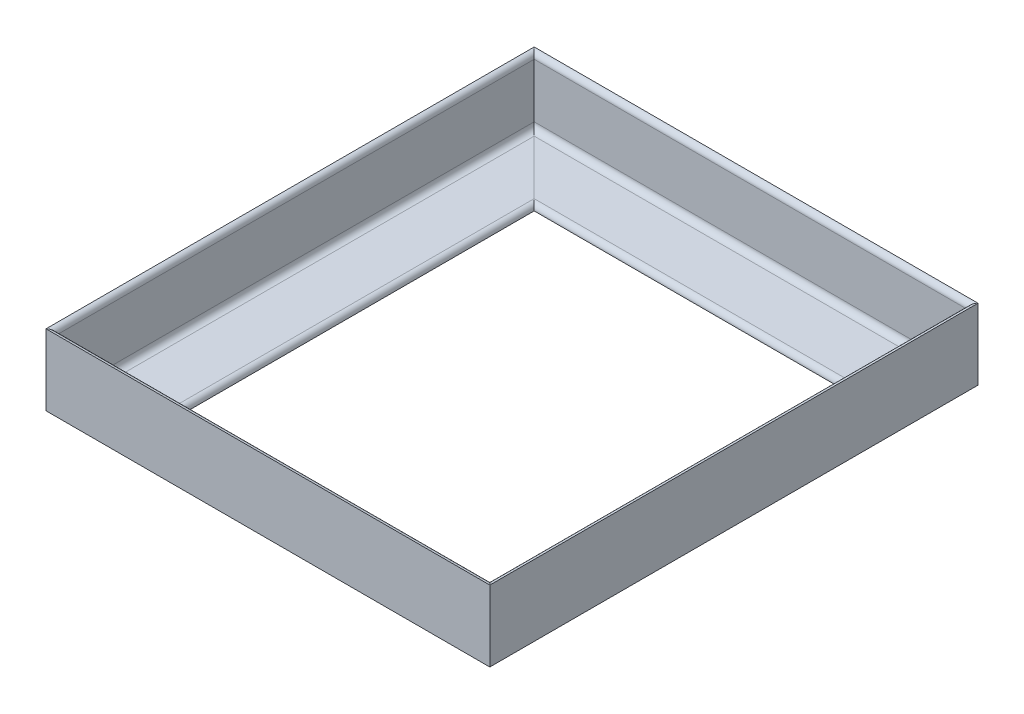
ISO-10303-21;
HEADER;
FILE_DESCRIPTION(('STEP AP214'),'2;1');
FILE_NAME('part.step','',(''),(''),'','','');
FILE_SCHEMA(('AUTOMOTIVE_DESIGN { 1 0 10303 214 1 1 1 1 }'));
ENDSEC;
DATA;
#1=APPLICATION_CONTEXT('core data for automotive mechanical design processes');
#2=APPLICATION_PROTOCOL_DEFINITION('international standard','automotive_design',2000,#1);
#3=PRODUCT_CONTEXT('',#1,'mechanical');
#4=PRODUCT('Part','Part','',(#3));
#5=PRODUCT_RELATED_PRODUCT_CATEGORY('part','',(#4));
#6=PRODUCT_DEFINITION_FORMATION('','',#4);
#7=PRODUCT_DEFINITION_CONTEXT('part definition',#1,'design');
#8=PRODUCT_DEFINITION('design','',#6,#7);
#9=PRODUCT_DEFINITION_SHAPE('','',#8);
#10=(LENGTH_UNIT() NAMED_UNIT(*) SI_UNIT(.MILLI.,.METRE.));
#11=(NAMED_UNIT(*) PLANE_ANGLE_UNIT() SI_UNIT($,.RADIAN.));
#12=(NAMED_UNIT(*) SI_UNIT($,.STERADIAN.) SOLID_ANGLE_UNIT());
#13=UNCERTAINTY_MEASURE_WITH_UNIT(LENGTH_MEASURE(1.E-05),#10,'distance_accuracy_value','');
#14=(GEOMETRIC_REPRESENTATION_CONTEXT(3) GLOBAL_UNCERTAINTY_ASSIGNED_CONTEXT((#13)) GLOBAL_UNIT_ASSIGNED_CONTEXT((#10,
#11,#12)) REPRESENTATION_CONTEXT('',''));
#15=CARTESIAN_POINT('',(0.,0.,0.));
#16=DIRECTION('',(0.,0.,1.));
#17=DIRECTION('',(1.,0.,0.));
#18=AXIS2_PLACEMENT_3D('',#15,#16,#17);
#19=CARTESIAN_POINT('',(-125.,40.,-137.5));
#20=DIRECTION('',(1.,0.,0.));
#21=DIRECTION('',(0.,1.,0.));
#22=AXIS2_PLACEMENT_3D('',#19,#20,#21);
#23=PLANE('',#22);
#24=DIRECTION('',(0.,-1.,0.));
#25=VECTOR('',#24,1.);
#26=CARTESIAN_POINT('',(-125.,40.0000000000029,137.5));
#27=LINE('',#26,#25);
#28=CARTESIAN_POINT('',(-125.,40.,137.5));
#29=VERTEX_POINT('',#28);
#30=CARTESIAN_POINT('',(-125.,0.,137.5));
#31=VERTEX_POINT('',#30);
#32=EDGE_CURVE('E144',#29,#31,#27,.T.);
#33=ORIENTED_EDGE('',*,*,#32,.F.);
#34=DIRECTION('',(0.,0.,1.));
#35=VECTOR('',#34,1.);
#36=CARTESIAN_POINT('',(-125.,40.,-137.5));
#37=LINE('',#36,#35);
#38=CARTESIAN_POINT('',(-125.,40.,-137.5));
#39=VERTEX_POINT('',#38);
#40=EDGE_CURVE('E169',#39,#29,#37,.T.);
#41=ORIENTED_EDGE('',*,*,#40,.F.);
#42=DIRECTION('',(0.,1.,0.));
#43=VECTOR('',#42,1.);
#44=CARTESIAN_POINT('',(-125.,40.,-137.5));
#45=LINE('',#44,#43);
#46=CARTESIAN_POINT('',(-125.,0.,-137.5));
#47=VERTEX_POINT('',#46);
#48=EDGE_CURVE('E135',#47,#39,#45,.T.);
#49=ORIENTED_EDGE('',*,*,#48,.F.);
#50=DIRECTION('',(0.,0.,1.));
#51=VECTOR('',#50,1.);
#52=CARTESIAN_POINT('',(-125.,0.,-137.5));
#53=LINE('',#52,#51);
#54=EDGE_CURVE('E78',#47,#31,#53,.T.);
#55=ORIENTED_EDGE('',*,*,#54,.T.);
#56=EDGE_LOOP('',(#33,#41,#49,#55));
#57=FACE_BOUND('',#56,.T.);
#58=ADVANCED_FACE('F74',(#57),#23,.F.);
#59=CARTESIAN_POINT('',(-125.,37.,-137.5));
#60=DIRECTION('',(0.,0.,1.));
#61=DIRECTION('',(1.,0.,0.));
#62=AXIS2_PLACEMENT_3D('',#59,#60,#61);
#63=CYLINDRICAL_SURFACE('',#62,3.00000000000001);
#64=CARTESIAN_POINT('',(-125.,37.,137.5));
#65=DIRECTION('',(0.707106781186548,0.,0.707106781186547));
#66=DIRECTION('',(-0.707106781186547,0.,0.707106781186548));
#67=AXIS2_PLACEMENT_3D('',#64,#65,#66);
#68=ELLIPSE('',#67,4.24264068711929,3.00000000000001);
#69=CARTESIAN_POINT('',(-122.,37.,134.5));
#70=VERTEX_POINT('',#69);
#71=EDGE_CURVE('E141',#70,#29,#68,.T.);
#72=ORIENTED_EDGE('',*,*,#71,.F.);
#73=DIRECTION('',(0.,0.,1.));
#74=VECTOR('',#73,1.);
#75=CARTESIAN_POINT('',(-122.,37.,-137.5));
#76=LINE('',#75,#74);
#77=CARTESIAN_POINT('',(-122.,37.,-134.5));
#78=VERTEX_POINT('',#77);
#79=EDGE_CURVE('E167',#78,#70,#76,.T.);
#80=ORIENTED_EDGE('',*,*,#79,.F.);
#81=CARTESIAN_POINT('',(-125.,37.,-137.5));
#82=DIRECTION('',(0.707106781186547,0.,-0.707106781186548));
#83=DIRECTION('',(0.707106781186548,0.,0.707106781186547));
#84=AXIS2_PLACEMENT_3D('',#81,#82,#83);
#85=ELLIPSE('',#84,4.24264068711929,3.00000000000001);
#86=EDGE_CURVE('E191',#39,#78,#85,.T.);
#87=ORIENTED_EDGE('',*,*,#86,.F.);
#88=ORIENTED_EDGE('',*,*,#40,.T.);
#89=EDGE_LOOP('',(#72,#80,#87,#88));
#90=FACE_BOUND('',#89,.T.);
#91=ADVANCED_FACE('F183',(#90),#63,.T.);
#92=CARTESIAN_POINT('',(-122.,6.49999999999997,-137.5));
#93=DIRECTION('',(-1.,0.,0.));
#94=DIRECTION('',(0.,-1.,0.));
#95=AXIS2_PLACEMENT_3D('',#92,#93,#94);
#96=PLANE('',#95);
#97=DIRECTION('',(0.,1.,0.));
#98=VECTOR('',#97,1.);
#99=CARTESIAN_POINT('',(-122.,6.50000000000282,134.5));
#100=LINE('',#99,#98);
#101=CARTESIAN_POINT('',(-122.,6.49999999999997,134.5));
#102=VERTEX_POINT('',#101);
#103=EDGE_CURVE('E14',#102,#70,#100,.T.);
#104=ORIENTED_EDGE('',*,*,#103,.F.);
#105=DIRECTION('',(0.,0.,1.));
#106=VECTOR('',#105,1.);
#107=CARTESIAN_POINT('',(-122.,6.49999999999997,-137.5));
#108=LINE('',#107,#106);
#109=CARTESIAN_POINT('',(-122.,6.49999999999997,-134.5));
#110=VERTEX_POINT('',#109);
#111=EDGE_CURVE('E164',#110,#102,#108,.T.);
#112=ORIENTED_EDGE('',*,*,#111,.F.);
#113=DIRECTION('',(0.,-1.,0.));
#114=VECTOR('',#113,1.);
#115=CARTESIAN_POINT('',(-122.,6.49999999999994,-134.5));
#116=LINE('',#115,#114);
#117=EDGE_CURVE('E190',#78,#110,#116,.T.);
#118=ORIENTED_EDGE('',*,*,#117,.F.);
#119=ORIENTED_EDGE('',*,*,#79,.T.);
#120=EDGE_LOOP('',(#104,#112,#118,#119));
#121=FACE_BOUND('',#120,.T.);
#122=ADVANCED_FACE('F187',(#121),#96,.F.);
#123=CARTESIAN_POINT('',(-118.5,6.49999999999993,-137.5));
#124=DIRECTION('',(0.,0.,1.));
#125=DIRECTION('',(1.,0.,0.));
#126=AXIS2_PLACEMENT_3D('',#123,#124,#125);
#127=CYLINDRICAL_SURFACE('',#126,3.49999999999999);
#128=CARTESIAN_POINT('',(-118.5,6.49999999999993,131.));
#129=DIRECTION('',(0.707106781186548,0.,0.707106781186547));
#130=DIRECTION('',(-0.707106781186547,0.,0.707106781186548));
#131=AXIS2_PLACEMENT_3D('',#128,#129,#130);
#132=ELLIPSE('',#131,4.94974746830583,3.49999999999999);
#133=CARTESIAN_POINT('',(-118.5,2.99999999999993,131.));
#134=VERTEX_POINT('',#133);
#135=EDGE_CURVE('E83',#134,#102,#132,.F.);
#136=ORIENTED_EDGE('',*,*,#135,.F.);
#137=DIRECTION('',(0.,0.,1.));
#138=VECTOR('',#137,1.);
#139=CARTESIAN_POINT('',(-118.5,2.99999999999993,-137.5));
#140=LINE('',#139,#138);
#141=CARTESIAN_POINT('',(-118.5,2.99999999999993,-131.));
#142=VERTEX_POINT('',#141);
#143=EDGE_CURVE('E161',#142,#134,#140,.T.);
#144=ORIENTED_EDGE('',*,*,#143,.F.);
#145=CARTESIAN_POINT('',(-118.5,6.49999999999993,-131.));
#146=DIRECTION('',(0.707106781186547,0.,-0.707106781186548));
#147=DIRECTION('',(0.707106781186548,0.,0.707106781186547));
#148=AXIS2_PLACEMENT_3D('',#145,#146,#147);
#149=ELLIPSE('',#148,4.94974746830582,3.49999999999999);
#150=EDGE_CURVE('E146',#110,#142,#149,.F.);
#151=ORIENTED_EDGE('',*,*,#150,.F.);
#152=ORIENTED_EDGE('',*,*,#111,.T.);
#153=EDGE_LOOP('',(#136,#144,#151,#152));
#154=FACE_BOUND('',#153,.T.);
#155=ADVANCED_FACE('F198',(#154),#127,.F.);
#156=CARTESIAN_POINT('',(-88.,2.99999999999961,-137.5));
#157=DIRECTION('',(0.,-1.,0.));
#158=DIRECTION('',(1.,0.,0.));
#159=AXIS2_PLACEMENT_3D('',#156,#157,#158);
#160=PLANE('',#159);
#161=DIRECTION('',(-0.707106781186547,0.,0.707106781186548));
#162=VECTOR('',#161,1.);
#163=CARTESIAN_POINT('',(31.,2.99999999999834,-18.5));
#164=LINE('',#163,#162);
#165=CARTESIAN_POINT('',(-88.,2.99999999999961,100.5));
#166=VERTEX_POINT('',#165);
#167=EDGE_CURVE('E155',#166,#134,#164,.T.);
#168=ORIENTED_EDGE('',*,*,#167,.F.);
#169=DIRECTION('',(0.,0.,1.));
#170=VECTOR('',#169,1.);
#171=CARTESIAN_POINT('',(-88.,2.99999999999961,-137.5));
#172=LINE('',#171,#170);
#173=CARTESIAN_POINT('',(-88.,2.99999999999961,-100.5));
#174=VERTEX_POINT('',#173);
#175=EDGE_CURVE('E129',#174,#166,#172,.T.);
#176=ORIENTED_EDGE('',*,*,#175,.F.);
#177=DIRECTION('',(0.707106781186548,0.,0.707106781186547));
#178=VECTOR('',#177,1.);
#179=CARTESIAN_POINT('',(-106.5,2.99999999999981,-119.));
#180=LINE('',#179,#178);
#181=EDGE_CURVE('E140',#142,#174,#180,.T.);
#182=ORIENTED_EDGE('',*,*,#181,.F.);
#183=ORIENTED_EDGE('',*,*,#143,.T.);
#184=EDGE_LOOP('',(#168,#176,#182,#183));
#185=FACE_BOUND('',#184,.T.);
#186=ADVANCED_FACE('F201',(#185),#160,.F.);
#187=CARTESIAN_POINT('',(-88.0000000000001,-3.91523843261786E-13,-137.5));
#188=DIRECTION('',(0.,0.,1.));
#189=DIRECTION('',(1.,0.,0.));
#190=AXIS2_PLACEMENT_3D('',#187,#188,#189);
#191=CYLINDRICAL_SURFACE('',#190,3.);
#192=CARTESIAN_POINT('',(-88.0000000000001,-3.91523843261786E-13,100.5));
#193=DIRECTION('',(0.707106781186548,0.,0.707106781186547));
#194=DIRECTION('',(-0.707106781186547,0.,0.707106781186548));
#195=AXIS2_PLACEMENT_3D('',#192,#193,#194);
#196=ELLIPSE('',#195,4.24264068711929,3.);
#197=CARTESIAN_POINT('',(-85.0000000000001,-4.18977760661176E-13,97.5000000000001));
#198=VERTEX_POINT('',#197);
#199=EDGE_CURVE('E126',#198,#166,#196,.T.);
#200=ORIENTED_EDGE('',*,*,#199,.F.);
#201=DIRECTION('',(0.,0.,1.));
#202=VECTOR('',#201,1.);
#203=CARTESIAN_POINT('',(-85.,-4.18977760661176E-13,-137.5));
#204=LINE('',#203,#202);
#205=CARTESIAN_POINT('',(-85.,-4.18977760661176E-13,-97.4999999999999));
#206=VERTEX_POINT('',#205);
#207=EDGE_CURVE('E91',#206,#198,#204,.T.);
#208=ORIENTED_EDGE('',*,*,#207,.F.);
#209=CARTESIAN_POINT('',(-88.0000000000001,-3.91523843261786E-13,-100.5));
#210=DIRECTION('',(0.707106781186547,0.,-0.707106781186548));
#211=DIRECTION('',(0.707106781186548,0.,0.707106781186547));
#212=AXIS2_PLACEMENT_3D('',#209,#210,#211);
#213=ELLIPSE('',#212,4.24264068711929,3.);
#214=EDGE_CURVE('E123',#174,#206,#213,.T.);
#215=ORIENTED_EDGE('',*,*,#214,.F.);
#216=ORIENTED_EDGE('',*,*,#175,.T.);
#217=EDGE_LOOP('',(#200,#208,#215,#216));
#218=FACE_BOUND('',#217,.T.);
#219=ADVANCED_FACE('F120',(#218),#191,.T.);
#220=CARTESIAN_POINT('',(-125.,0.,-137.5));
#221=DIRECTION('',(0.,1.,0.));
#222=DIRECTION('',(-1.,0.,0.));
#223=AXIS2_PLACEMENT_3D('',#220,#221,#222);
#224=PLANE('',#223);
#225=DIRECTION('',(0.707106781186547,0.,-0.707106781186548));
#226=VECTOR('',#225,1.);
#227=CARTESIAN_POINT('',(12.5,-1.44023605227279E-12,0.));
#228=LINE('',#227,#226);
#229=EDGE_CURVE('E151',#31,#198,#228,.T.);
#230=ORIENTED_EDGE('',*,*,#229,.F.);
#231=ORIENTED_EDGE('',*,*,#54,.F.);
#232=DIRECTION('',(-0.707106781186548,0.,-0.707106781186547));
#233=VECTOR('',#232,1.);
#234=CARTESIAN_POINT('',(-125.,0.,-137.5));
#235=LINE('',#234,#233);
#236=EDGE_CURVE('E128',#206,#47,#235,.T.);
#237=ORIENTED_EDGE('',*,*,#236,.F.);
#238=ORIENTED_EDGE('',*,*,#207,.T.);
#239=EDGE_LOOP('',(#230,#231,#237,#238));
#240=FACE_BOUND('',#239,.T.);
#241=ADVANCED_FACE('F132',(#240),#224,.F.);
#242=CARTESIAN_POINT('',(-125.,0.,-137.5));
#243=DIRECTION('',(0.707106781186547,0.,-0.707106781186548));
#244=DIRECTION('',(-0.707106781186548,0.,-0.707106781186547));
#245=AXIS2_PLACEMENT_3D('',#242,#243,#244);
#246=PLANE('',#245);
#247=ORIENTED_EDGE('',*,*,#236,.T.);
#248=ORIENTED_EDGE('',*,*,#48,.T.);
#249=ORIENTED_EDGE('',*,*,#86,.T.);
#250=ORIENTED_EDGE('',*,*,#117,.T.);
#251=ORIENTED_EDGE('',*,*,#150,.T.);
#252=ORIENTED_EDGE('',*,*,#181,.T.);
#253=ORIENTED_EDGE('',*,*,#214,.T.);
#254=EDGE_LOOP('',(#247,#248,#249,#250,#251,#252,#253));
#255=FACE_BOUND('',#254,.T.);
#256=ADVANCED_FACE('F138',(#255),#246,.T.);
#257=CARTESIAN_POINT('',(-125.,0.,137.5));
#258=DIRECTION('',(0.707106781186548,0.,0.707106781186547));
#259=DIRECTION('',(0.707106781186547,0.,-0.707106781186548));
#260=AXIS2_PLACEMENT_3D('',#257,#258,#259);
#261=PLANE('',#260);
#262=ORIENTED_EDGE('',*,*,#71,.T.);
#263=ORIENTED_EDGE('',*,*,#32,.T.);
#264=ORIENTED_EDGE('',*,*,#229,.T.);
#265=ORIENTED_EDGE('',*,*,#199,.T.);
#266=ORIENTED_EDGE('',*,*,#167,.T.);
#267=ORIENTED_EDGE('',*,*,#135,.T.);
#268=ORIENTED_EDGE('',*,*,#103,.T.);
#269=EDGE_LOOP('',(#262,#263,#264,#265,#266,#267,#268));
#270=FACE_BOUND('',#269,.T.);
#271=ADVANCED_FACE('F76',(#270),#261,.T.);
#272=CLOSED_SHELL('',(#58,#91,#122,#155,#186,#219,#241,#256,#271));
#273=MANIFOLD_SOLID_BREP('B2',#272);
#274=CARTESIAN_POINT('',(-125.,40.,137.5));
#275=DIRECTION('',(0.,0.,-1.));
#276=DIRECTION('',(0.,1.,0.));
#277=AXIS2_PLACEMENT_3D('',#274,#275,#276);
#278=PLANE('',#277);
#279=DIRECTION('',(0.,1.,0.));
#280=VECTOR('',#279,1.);
#281=CARTESIAN_POINT('',(-125.,40.,137.5));
#282=LINE('',#281,#280);
#283=CARTESIAN_POINT('',(-125.,0.,137.5));
#284=VERTEX_POINT('',#283);
#285=CARTESIAN_POINT('',(-125.,40.,137.5));
#286=VERTEX_POINT('',#285);
#287=EDGE_CURVE('E411',#284,#286,#282,.T.);
#288=ORIENTED_EDGE('',*,*,#287,.F.);
#289=DIRECTION('',(1.,0.,0.));
#290=VECTOR('',#289,1.);
#291=CARTESIAN_POINT('',(-125.,0.,137.5));
#292=LINE('',#291,#290);
#293=CARTESIAN_POINT('',(125.,0.,137.5));
#294=VERTEX_POINT('',#293);
#295=EDGE_CURVE('E325',#284,#294,#292,.T.);
#296=ORIENTED_EDGE('',*,*,#295,.T.);
#297=DIRECTION('',(0.,-1.,0.));
#298=VECTOR('',#297,1.);
#299=CARTESIAN_POINT('',(125.,40.0000000000026,137.5));
#300=LINE('',#299,#298);
#301=CARTESIAN_POINT('',(125.,40.,137.5));
#302=VERTEX_POINT('',#301);
#303=EDGE_CURVE('E428',#302,#294,#300,.T.);
#304=ORIENTED_EDGE('',*,*,#303,.F.);
#305=DIRECTION('',(1.,0.,0.));
#306=VECTOR('',#305,1.);
#307=CARTESIAN_POINT('',(-125.,40.,137.5));
#308=LINE('',#307,#306);
#309=EDGE_CURVE('E422',#286,#302,#308,.T.);
#310=ORIENTED_EDGE('',*,*,#309,.F.);
#311=EDGE_LOOP('',(#288,#296,#304,#310));
#312=FACE_BOUND('',#311,.T.);
#313=ADVANCED_FACE('F321',(#312),#278,.F.);
#314=CARTESIAN_POINT('',(-125.,37.,137.5));
#315=DIRECTION('',(1.,0.,0.));
#316=DIRECTION('',(0.,0.,-1.));
#317=AXIS2_PLACEMENT_3D('',#314,#315,#316);
#318=CYLINDRICAL_SURFACE('',#317,3.00000000000001);
#319=CARTESIAN_POINT('',(-125.,37.,137.5));
#320=DIRECTION('',(-0.707106781186548,0.,-0.707106781186548));
#321=DIRECTION('',(0.707106781186548,0.,-0.707106781186548));
#322=AXIS2_PLACEMENT_3D('',#319,#320,#321);
#323=ELLIPSE('',#322,4.24264068711929,3.00000000000001);
#324=CARTESIAN_POINT('',(-122.,37.,134.5));
#325=VERTEX_POINT('',#324);
#326=EDGE_CURVE('E376',#286,#325,#323,.T.);
#327=ORIENTED_EDGE('',*,*,#326,.F.);
#328=ORIENTED_EDGE('',*,*,#309,.T.);
#329=CARTESIAN_POINT('',(125.,37.,137.5));
#330=DIRECTION('',(0.707106781186547,0.,-0.707106781186548));
#331=DIRECTION('',(0.707106781186548,0.,0.707106781186547));
#332=AXIS2_PLACEMENT_3D('',#329,#330,#331);
#333=ELLIPSE('',#332,4.24264068711929,3.00000000000001);
#334=CARTESIAN_POINT('',(122.,37.,134.5));
#335=VERTEX_POINT('',#334);
#336=EDGE_CURVE('E418',#335,#302,#333,.T.);
#337=ORIENTED_EDGE('',*,*,#336,.F.);
#338=DIRECTION('',(1.,0.,0.));
#339=VECTOR('',#338,1.);
#340=CARTESIAN_POINT('',(-125.,37.,134.5));
#341=LINE('',#340,#339);
#342=EDGE_CURVE('E421',#325,#335,#341,.T.);
#343=ORIENTED_EDGE('',*,*,#342,.F.);
#344=EDGE_LOOP('',(#327,#328,#337,#343));
#345=FACE_BOUND('',#344,.T.);
#346=ADVANCED_FACE('F424',(#345),#318,.T.);
#347=CARTESIAN_POINT('',(-125.,6.49999999999997,134.5));
#348=DIRECTION('',(0.,0.,1.));
#349=DIRECTION('',(0.,-1.,0.));
#350=AXIS2_PLACEMENT_3D('',#347,#348,#349);
#351=PLANE('',#350);
#352=DIRECTION('',(0.,-1.,0.));
#353=VECTOR('',#352,1.);
#354=CARTESIAN_POINT('',(-122.,6.49999999999994,134.5));
#355=LINE('',#354,#353);
#356=CARTESIAN_POINT('',(-122.,6.49999999999997,134.5));
#357=VERTEX_POINT('',#356);
#358=EDGE_CURVE('E406',#325,#357,#355,.T.);
#359=ORIENTED_EDGE('',*,*,#358,.F.);
#360=ORIENTED_EDGE('',*,*,#342,.T.);
#361=DIRECTION('',(0.,1.,0.));
#362=VECTOR('',#361,1.);
#363=CARTESIAN_POINT('',(122.,6.50000000000256,134.5));
#364=LINE('',#363,#362);
#365=CARTESIAN_POINT('',(122.,6.49999999999997,134.5));
#366=VERTEX_POINT('',#365);
#367=EDGE_CURVE('E416',#366,#335,#364,.T.);
#368=ORIENTED_EDGE('',*,*,#367,.F.);
#369=DIRECTION('',(1.,0.,0.));
#370=VECTOR('',#369,1.);
#371=CARTESIAN_POINT('',(-125.,6.49999999999997,134.5));
#372=LINE('',#371,#370);
#373=EDGE_CURVE('E402',#357,#366,#372,.T.);
#374=ORIENTED_EDGE('',*,*,#373,.F.);
#375=EDGE_LOOP('',(#359,#360,#368,#374));
#376=FACE_BOUND('',#375,.T.);
#377=ADVANCED_FACE('F459',(#376),#351,.F.);
#378=CARTESIAN_POINT('',(-125.,6.49999999999993,131.));
#379=DIRECTION('',(1.,0.,0.));
#380=DIRECTION('',(0.,0.,-1.));
#381=AXIS2_PLACEMENT_3D('',#378,#379,#380);
#382=CYLINDRICAL_SURFACE('',#381,3.49999999999999);
#383=CARTESIAN_POINT('',(-118.5,6.49999999999993,131.));
#384=DIRECTION('',(-0.707106781186548,0.,-0.707106781186548));
#385=DIRECTION('',(0.707106781186548,0.,-0.707106781186548));
#386=AXIS2_PLACEMENT_3D('',#383,#384,#385);
#387=ELLIPSE('',#386,4.94974746830582,3.49999999999999);
#388=CARTESIAN_POINT('',(-118.5,2.99999999999993,131.));
#389=VERTEX_POINT('',#388);
#390=EDGE_CURVE('E394',#357,#389,#387,.F.);
#391=ORIENTED_EDGE('',*,*,#390,.F.);
#392=ORIENTED_EDGE('',*,*,#373,.T.);
#393=CARTESIAN_POINT('',(118.5,6.49999999999993,131.));
#394=DIRECTION('',(0.707106781186547,0.,-0.707106781186548));
#395=DIRECTION('',(0.707106781186548,0.,0.707106781186547));
#396=AXIS2_PLACEMENT_3D('',#393,#394,#395);
#397=ELLIPSE('',#396,4.94974746830583,3.49999999999999);
#398=CARTESIAN_POINT('',(118.5,2.99999999999993,131.));
#399=VERTEX_POINT('',#398);
#400=EDGE_CURVE('E400',#399,#366,#397,.F.);
#401=ORIENTED_EDGE('',*,*,#400,.F.);
#402=DIRECTION('',(1.,0.,0.));
#403=VECTOR('',#402,1.);
#404=CARTESIAN_POINT('',(-125.,2.99999999999993,131.));
#405=LINE('',#404,#403);
#406=EDGE_CURVE('E389',#389,#399,#405,.T.);
#407=ORIENTED_EDGE('',*,*,#406,.F.);
#408=EDGE_LOOP('',(#391,#392,#401,#407));
#409=FACE_BOUND('',#408,.T.);
#410=ADVANCED_FACE('F397',(#409),#382,.F.);
#411=CARTESIAN_POINT('',(-125.,2.99999999999961,100.5));
#412=DIRECTION('',(0.,-1.,0.));
#413=DIRECTION('',(0.,0.,-1.));
#414=AXIS2_PLACEMENT_3D('',#411,#412,#413);
#415=PLANE('',#414);
#416=DIRECTION('',(0.707106781186548,0.,-0.707106781186548));
#417=VECTOR('',#416,1.);
#418=CARTESIAN_POINT('',(-106.5,2.99999999999981,119.));
#419=LINE('',#418,#417);
#420=CARTESIAN_POINT('',(-88.0000000000001,2.99999999999961,100.5));
#421=VERTEX_POINT('',#420);
#422=EDGE_CURVE('E330',#389,#421,#419,.T.);
#423=ORIENTED_EDGE('',*,*,#422,.F.);
#424=ORIENTED_EDGE('',*,*,#406,.T.);
#425=DIRECTION('',(0.707106781186548,0.,0.707106781186547));
#426=VECTOR('',#425,1.);
#427=CARTESIAN_POINT('',(-18.5,2.99999999999847,-5.99999999999983));
#428=LINE('',#427,#426);
#429=CARTESIAN_POINT('',(88.,2.99999999999961,100.5));
#430=VERTEX_POINT('',#429);
#431=EDGE_CURVE('E439',#430,#399,#428,.T.);
#432=ORIENTED_EDGE('',*,*,#431,.F.);
#433=DIRECTION('',(1.,0.,0.));
#434=VECTOR('',#433,1.);
#435=CARTESIAN_POINT('',(-125.,2.99999999999961,100.5));
#436=LINE('',#435,#434);
#437=EDGE_CURVE('E391',#421,#430,#436,.T.);
#438=ORIENTED_EDGE('',*,*,#437,.F.);
#439=EDGE_LOOP('',(#423,#424,#432,#438));
#440=FACE_BOUND('',#439,.T.);
#441=ADVANCED_FACE('F387',(#440),#415,.F.);
#442=CARTESIAN_POINT('',(-125.,-3.91523843261786E-13,100.5));
#443=DIRECTION('',(1.,0.,0.));
#444=DIRECTION('',(0.,0.,-1.));
#445=AXIS2_PLACEMENT_3D('',#442,#443,#444);
#446=CYLINDRICAL_SURFACE('',#445,3.);
#447=CARTESIAN_POINT('',(-88.0000000000001,-3.91523843261786E-13,100.5));
#448=DIRECTION('',(-0.707106781186548,0.,-0.707106781186548));
#449=DIRECTION('',(0.707106781186548,0.,-0.707106781186548));
#450=AXIS2_PLACEMENT_3D('',#447,#448,#449);
#451=ELLIPSE('',#450,4.24264068711929,3.);
#452=CARTESIAN_POINT('',(-84.9999999999999,-4.18977760661176E-13,97.5000000000001));
#453=VERTEX_POINT('',#452);
#454=EDGE_CURVE('E72',#421,#453,#451,.T.);
#455=ORIENTED_EDGE('',*,*,#454,.F.);
#456=ORIENTED_EDGE('',*,*,#437,.T.);
#457=CARTESIAN_POINT('',(88.,-3.91523843261786E-13,100.5));
#458=DIRECTION('',(0.707106781186547,0.,-0.707106781186548));
#459=DIRECTION('',(0.707106781186548,0.,0.707106781186547));
#460=AXIS2_PLACEMENT_3D('',#457,#458,#459);
#461=ELLIPSE('',#460,4.24264068711929,3.);
#462=CARTESIAN_POINT('',(85.,-4.18977760661176E-13,97.5000000000001));
#463=VERTEX_POINT('',#462);
#464=EDGE_CURVE('E441',#463,#430,#461,.T.);
#465=ORIENTED_EDGE('',*,*,#464,.F.);
#466=DIRECTION('',(1.,0.,0.));
#467=VECTOR('',#466,1.);
#468=CARTESIAN_POINT('',(-125.,-4.18977760661176E-13,97.5000000000001));
#469=LINE('',#468,#467);
#470=EDGE_CURVE('E343',#453,#463,#469,.T.);
#471=ORIENTED_EDGE('',*,*,#470,.F.);
#472=EDGE_LOOP('',(#455,#456,#465,#471));
#473=FACE_BOUND('',#472,.T.);
#474=ADVANCED_FACE('F446',(#473),#446,.T.);
#475=CARTESIAN_POINT('',(-125.,0.,137.5));
#476=DIRECTION('',(0.,1.,0.));
#477=DIRECTION('',(0.,0.,1.));
#478=AXIS2_PLACEMENT_3D('',#475,#476,#477);
#479=PLANE('',#478);
#480=DIRECTION('',(-0.707106781186548,0.,0.707106781186548));
#481=VECTOR('',#480,1.);
#482=CARTESIAN_POINT('',(-125.,0.,137.5));
#483=LINE('',#482,#481);
#484=EDGE_CURVE('E414',#453,#284,#483,.T.);
#485=ORIENTED_EDGE('',*,*,#484,.F.);
#486=ORIENTED_EDGE('',*,*,#470,.T.);
#487=DIRECTION('',(-0.707106781186548,0.,-0.707106781186547));
#488=VECTOR('',#487,1.);
#489=CARTESIAN_POINT('',(0.,-1.30930550206617E-12,12.5000000000002));
#490=LINE('',#489,#488);
#491=EDGE_CURVE('E431',#294,#463,#490,.T.);
#492=ORIENTED_EDGE('',*,*,#491,.F.);
#493=ORIENTED_EDGE('',*,*,#295,.F.);
#494=EDGE_LOOP('',(#485,#486,#492,#493));
#495=FACE_BOUND('',#494,.T.);
#496=ADVANCED_FACE('F444',(#495),#479,.F.);
#497=CARTESIAN_POINT('',(125.,0.,137.5));
#498=DIRECTION('',(0.707106781186547,0.,-0.707106781186548));
#499=DIRECTION('',(-0.707106781186548,0.,-0.707106781186547));
#500=AXIS2_PLACEMENT_3D('',#497,#498,#499);
#501=PLANE('',#500);
#502=ORIENTED_EDGE('',*,*,#336,.T.);
#503=ORIENTED_EDGE('',*,*,#303,.T.);
#504=ORIENTED_EDGE('',*,*,#491,.T.);
#505=ORIENTED_EDGE('',*,*,#464,.T.);
#506=ORIENTED_EDGE('',*,*,#431,.T.);
#507=ORIENTED_EDGE('',*,*,#400,.T.);
#508=ORIENTED_EDGE('',*,*,#367,.T.);
#509=EDGE_LOOP('',(#502,#503,#504,#505,#506,#507,#508));
#510=FACE_BOUND('',#509,.T.);
#511=ADVANCED_FACE('F433',(#510),#501,.T.);
#512=CARTESIAN_POINT('',(-125.,0.,137.5));
#513=DIRECTION('',(-0.707106781186548,0.,-0.707106781186548));
#514=DIRECTION('',(-0.707106781186548,0.,0.707106781186548));
#515=AXIS2_PLACEMENT_3D('',#512,#513,#514);
#516=PLANE('',#515);
#517=ORIENTED_EDGE('',*,*,#484,.T.);
#518=ORIENTED_EDGE('',*,*,#287,.T.);
#519=ORIENTED_EDGE('',*,*,#326,.T.);
#520=ORIENTED_EDGE('',*,*,#358,.T.);
#521=ORIENTED_EDGE('',*,*,#390,.T.);
#522=ORIENTED_EDGE('',*,*,#422,.T.);
#523=ORIENTED_EDGE('',*,*,#454,.T.);
#524=EDGE_LOOP('',(#517,#518,#519,#520,#521,#522,#523));
#525=FACE_BOUND('',#524,.T.);
#526=ADVANCED_FACE('F323',(#525),#516,.T.);
#527=CLOSED_SHELL('',(#313,#346,#377,#410,#441,#474,#496,#511,#526));
#528=MANIFOLD_SOLID_BREP('B8',#527);
#529=CARTESIAN_POINT('',(125.,40.,-137.5));
#530=DIRECTION('',(0.,0.,1.));
#531=DIRECTION('',(0.,-1.,0.));
#532=AXIS2_PLACEMENT_3D('',#529,#530,#531);
#533=PLANE('',#532);
#534=DIRECTION('',(0.,-1.,0.));
#535=VECTOR('',#534,1.);
#536=CARTESIAN_POINT('',(-125.,40.0000000000026,-137.5));
#537=LINE('',#536,#535);
#538=CARTESIAN_POINT('',(-125.,40.,-137.5));
#539=VERTEX_POINT('',#538);
#540=CARTESIAN_POINT('',(-125.,0.,-137.5));
#541=VERTEX_POINT('',#540);
#542=EDGE_CURVE('E637',#539,#541,#537,.T.);
#543=ORIENTED_EDGE('',*,*,#542,.F.);
#544=DIRECTION('',(-1.,0.,0.));
#545=VECTOR('',#544,1.);
#546=CARTESIAN_POINT('',(125.,40.,-137.5));
#547=LINE('',#546,#545);
#548=CARTESIAN_POINT('',(125.,40.,-137.5));
#549=VERTEX_POINT('',#548);
#550=EDGE_CURVE('E662',#549,#539,#547,.T.);
#551=ORIENTED_EDGE('',*,*,#550,.F.);
#552=DIRECTION('',(0.,1.,0.));
#553=VECTOR('',#552,1.);
#554=CARTESIAN_POINT('',(125.,40.,-137.5));
#555=LINE('',#554,#553);
#556=CARTESIAN_POINT('',(125.,0.,-137.5));
#557=VERTEX_POINT('',#556);
#558=EDGE_CURVE('E628',#557,#549,#555,.T.);
#559=ORIENTED_EDGE('',*,*,#558,.F.);
#560=DIRECTION('',(-1.,0.,0.));
#561=VECTOR('',#560,1.);
#562=CARTESIAN_POINT('',(125.,0.,-137.5));
#563=LINE('',#562,#561);
#564=EDGE_CURVE('E571',#557,#541,#563,.T.);
#565=ORIENTED_EDGE('',*,*,#564,.T.);
#566=EDGE_LOOP('',(#543,#551,#559,#565));
#567=FACE_BOUND('',#566,.T.);
#568=ADVANCED_FACE('F567',(#567),#533,.F.);
#569=CARTESIAN_POINT('',(125.,37.,-137.5));
#570=DIRECTION('',(-1.,0.,0.));
#571=DIRECTION('',(0.,0.,1.));
#572=AXIS2_PLACEMENT_3D('',#569,#570,#571);
#573=CYLINDRICAL_SURFACE('',#572,3.00000000000001);
#574=CARTESIAN_POINT('',(-125.,37.,-137.5));
#575=DIRECTION('',(-0.707106781186548,0.,0.707106781186547));
#576=DIRECTION('',(-0.707106781186547,0.,-0.707106781186548));
#577=AXIS2_PLACEMENT_3D('',#574,#575,#576);
#578=ELLIPSE('',#577,4.24264068711929,3.00000000000001);
#579=CARTESIAN_POINT('',(-122.,37.,-134.5));
#580=VERTEX_POINT('',#579);
#581=EDGE_CURVE('E634',#580,#539,#578,.T.);
#582=ORIENTED_EDGE('',*,*,#581,.F.);
#583=DIRECTION('',(-1.,0.,0.));
#584=VECTOR('',#583,1.);
#585=CARTESIAN_POINT('',(125.,37.,-134.5));
#586=LINE('',#585,#584);
#587=CARTESIAN_POINT('',(122.,37.,-134.5));
#588=VERTEX_POINT('',#587);
#589=EDGE_CURVE('E660',#588,#580,#586,.T.);
#590=ORIENTED_EDGE('',*,*,#589,.F.);
#591=CARTESIAN_POINT('',(125.,37.,-137.5));
#592=DIRECTION('',(0.707106781186548,0.,0.707106781186547));
#593=DIRECTION('',(-0.707106781186547,0.,0.707106781186548));
#594=AXIS2_PLACEMENT_3D('',#591,#592,#593);
#595=ELLIPSE('',#594,4.24264068711929,3.00000000000001);
#596=EDGE_CURVE('E684',#549,#588,#595,.T.);
#597=ORIENTED_EDGE('',*,*,#596,.F.);
#598=ORIENTED_EDGE('',*,*,#550,.T.);
#599=EDGE_LOOP('',(#582,#590,#597,#598));
#600=FACE_BOUND('',#599,.T.);
#601=ADVANCED_FACE('F676',(#600),#573,.T.);
#602=CARTESIAN_POINT('',(125.,6.49999999999997,-134.5));
#603=DIRECTION('',(0.,0.,-1.));
#604=DIRECTION('',(0.,1.,0.));
#605=AXIS2_PLACEMENT_3D('',#602,#603,#604);
#606=PLANE('',#605);
#607=DIRECTION('',(0.,1.,0.));
#608=VECTOR('',#607,1.);
#609=CARTESIAN_POINT('',(-122.,6.50000000000256,-134.5));
#610=LINE('',#609,#608);
#611=CARTESIAN_POINT('',(-122.,6.49999999999997,-134.5));
#612=VERTEX_POINT('',#611);
#613=EDGE_CURVE('E319',#612,#580,#610,.T.);
#614=ORIENTED_EDGE('',*,*,#613,.F.);
#615=DIRECTION('',(-1.,0.,0.));
#616=VECTOR('',#615,1.);
#617=CARTESIAN_POINT('',(125.,6.49999999999997,-134.5));
#618=LINE('',#617,#616);
#619=CARTESIAN_POINT('',(122.,6.49999999999997,-134.5));
#620=VERTEX_POINT('',#619);
#621=EDGE_CURVE('E657',#620,#612,#618,.T.);
#622=ORIENTED_EDGE('',*,*,#621,.F.);
#623=DIRECTION('',(0.,-1.,0.));
#624=VECTOR('',#623,1.);
#625=CARTESIAN_POINT('',(122.,6.49999999999994,-134.5));
#626=LINE('',#625,#624);
#627=EDGE_CURVE('E683',#588,#620,#626,.T.);
#628=ORIENTED_EDGE('',*,*,#627,.F.);
#629=ORIENTED_EDGE('',*,*,#589,.T.);
#630=EDGE_LOOP('',(#614,#622,#628,#629));
#631=FACE_BOUND('',#630,.T.);
#632=ADVANCED_FACE('F680',(#631),#606,.F.);
#633=CARTESIAN_POINT('',(125.,6.49999999999993,-131.));
#634=DIRECTION('',(-1.,0.,0.));
#635=DIRECTION('',(0.,0.,1.));
#636=AXIS2_PLACEMENT_3D('',#633,#634,#635);
#637=CYLINDRICAL_SURFACE('',#636,3.49999999999999);
#638=CARTESIAN_POINT('',(-118.5,6.49999999999993,-131.));
#639=DIRECTION('',(-0.707106781186548,0.,0.707106781186547));
#640=DIRECTION('',(-0.707106781186547,0.,-0.707106781186548));
#641=AXIS2_PLACEMENT_3D('',#638,#639,#640);
#642=ELLIPSE('',#641,4.94974746830582,3.49999999999999);
#643=CARTESIAN_POINT('',(-118.5,2.99999999999993,-131.));
#644=VERTEX_POINT('',#643);
#645=EDGE_CURVE('E576',#644,#612,#642,.F.);
#646=ORIENTED_EDGE('',*,*,#645,.F.);
#647=DIRECTION('',(-1.,0.,0.));
#648=VECTOR('',#647,1.);
#649=CARTESIAN_POINT('',(125.,2.99999999999993,-131.));
#650=LINE('',#649,#648);
#651=CARTESIAN_POINT('',(118.5,2.99999999999993,-131.));
#652=VERTEX_POINT('',#651);
#653=EDGE_CURVE('E654',#652,#644,#650,.T.);
#654=ORIENTED_EDGE('',*,*,#653,.F.);
#655=CARTESIAN_POINT('',(118.5,6.49999999999993,-131.));
#656=DIRECTION('',(0.707106781186548,0.,0.707106781186547));
#657=DIRECTION('',(-0.707106781186547,0.,0.707106781186548));
#658=AXIS2_PLACEMENT_3D('',#655,#656,#657);
#659=ELLIPSE('',#658,4.94974746830582,3.49999999999999);
#660=EDGE_CURVE('E639',#620,#652,#659,.F.);
#661=ORIENTED_EDGE('',*,*,#660,.F.);
#662=ORIENTED_EDGE('',*,*,#621,.T.);
#663=EDGE_LOOP('',(#646,#654,#661,#662));
#664=FACE_BOUND('',#663,.T.);
#665=ADVANCED_FACE('F691',(#664),#637,.F.);
#666=CARTESIAN_POINT('',(125.,2.99999999999961,-100.5));
#667=DIRECTION('',(0.,-1.,0.));
#668=DIRECTION('',(0.,0.,-1.));
#669=AXIS2_PLACEMENT_3D('',#666,#667,#668);
#670=PLANE('',#669);
#671=DIRECTION('',(-0.707106781186547,0.,-0.707106781186548));
#672=VECTOR('',#671,1.);
#673=CARTESIAN_POINT('',(18.4999999999999,2.99999999999847,6.00000000000006));
#674=LINE('',#673,#672);
#675=CARTESIAN_POINT('',(-88.,2.99999999999961,-100.5));
#676=VERTEX_POINT('',#675);
#677=EDGE_CURVE('E648',#676,#644,#674,.T.);
#678=ORIENTED_EDGE('',*,*,#677,.F.);
#679=DIRECTION('',(-1.,0.,0.));
#680=VECTOR('',#679,1.);
#681=CARTESIAN_POINT('',(125.,2.99999999999961,-100.5));
#682=LINE('',#681,#680);
#683=CARTESIAN_POINT('',(87.9999999999999,2.99999999999961,-100.5));
#684=VERTEX_POINT('',#683);
#685=EDGE_CURVE('E622',#684,#676,#682,.T.);
#686=ORIENTED_EDGE('',*,*,#685,.F.);
#687=DIRECTION('',(-0.707106781186547,0.,0.707106781186548));
#688=VECTOR('',#687,1.);
#689=CARTESIAN_POINT('',(106.5,2.99999999999981,-119.));
#690=LINE('',#689,#688);
#691=EDGE_CURVE('E633',#652,#684,#690,.T.);
#692=ORIENTED_EDGE('',*,*,#691,.F.);
#693=ORIENTED_EDGE('',*,*,#653,.T.);
#694=EDGE_LOOP('',(#678,#686,#692,#693));
#695=FACE_BOUND('',#694,.T.);
#696=ADVANCED_FACE('F694',(#695),#670,.F.);
#697=CARTESIAN_POINT('',(125.,-3.91523843261786E-13,-100.5));
#698=DIRECTION('',(-1.,0.,0.));
#699=DIRECTION('',(0.,0.,1.));
#700=AXIS2_PLACEMENT_3D('',#697,#698,#699);
#701=CYLINDRICAL_SURFACE('',#700,3.);
#702=CARTESIAN_POINT('',(-88.0000000000001,-3.91523843261786E-13,-100.5));
#703=DIRECTION('',(-0.707106781186548,0.,0.707106781186547));
#704=DIRECTION('',(-0.707106781186547,0.,-0.707106781186548));
#705=AXIS2_PLACEMENT_3D('',#702,#703,#704);
#706=ELLIPSE('',#705,4.24264068711929,3.);
#707=CARTESIAN_POINT('',(-85.0000000000001,-4.18977760661176E-13,-97.4999999999999));
#708=VERTEX_POINT('',#707);
#709=EDGE_CURVE('E619',#708,#676,#706,.T.);
#710=ORIENTED_EDGE('',*,*,#709,.F.);
#711=DIRECTION('',(-1.,0.,0.));
#712=VECTOR('',#711,1.);
#713=CARTESIAN_POINT('',(125.,-4.18977760661176E-13,-97.4999999999999));
#714=LINE('',#713,#712);
#715=CARTESIAN_POINT('',(84.9999999999999,-4.18977760661176E-13,-97.4999999999999));
#716=VERTEX_POINT('',#715);
#717=EDGE_CURVE('E584',#716,#708,#714,.T.);
#718=ORIENTED_EDGE('',*,*,#717,.F.);
#719=CARTESIAN_POINT('',(87.9999999999999,-3.91523843261786E-13,-100.5));
#720=DIRECTION('',(0.707106781186548,0.,0.707106781186547));
#721=DIRECTION('',(-0.707106781186547,0.,0.707106781186548));
#722=AXIS2_PLACEMENT_3D('',#719,#720,#721);
#723=ELLIPSE('',#722,4.24264068711929,3.);
#724=EDGE_CURVE('E616',#684,#716,#723,.T.);
#725=ORIENTED_EDGE('',*,*,#724,.F.);
#726=ORIENTED_EDGE('',*,*,#685,.T.);
#727=EDGE_LOOP('',(#710,#718,#725,#726));
#728=FACE_BOUND('',#727,.T.);
#729=ADVANCED_FACE('F613',(#728),#701,.T.);
#730=CARTESIAN_POINT('',(125.,0.,-137.5));
#731=DIRECTION('',(0.,1.,0.));
#732=DIRECTION('',(0.,0.,1.));
#733=AXIS2_PLACEMENT_3D('',#730,#731,#732);
#734=PLANE('',#733);
#735=DIRECTION('',(0.707106781186547,0.,0.707106781186548));
#736=VECTOR('',#735,1.);
#737=CARTESIAN_POINT('',(0.,-1.30930550206618E-12,-12.5));
#738=LINE('',#737,#736);
#739=EDGE_CURVE('E644',#541,#708,#738,.T.);
#740=ORIENTED_EDGE('',*,*,#739,.F.);
#741=ORIENTED_EDGE('',*,*,#564,.F.);
#742=DIRECTION('',(0.707106781186547,0.,-0.707106781186548));
#743=VECTOR('',#742,1.);
#744=CARTESIAN_POINT('',(125.,0.,-137.5));
#745=LINE('',#744,#743);
#746=EDGE_CURVE('E621',#716,#557,#745,.T.);
#747=ORIENTED_EDGE('',*,*,#746,.F.);
#748=ORIENTED_EDGE('',*,*,#717,.T.);
#749=EDGE_LOOP('',(#740,#741,#747,#748));
#750=FACE_BOUND('',#749,.T.);
#751=ADVANCED_FACE('F625',(#750),#734,.F.);
#752=CARTESIAN_POINT('',(125.,0.,-137.5));
#753=DIRECTION('',(0.707106781186548,0.,0.707106781186547));
#754=DIRECTION('',(0.707106781186547,0.,-0.707106781186548));
#755=AXIS2_PLACEMENT_3D('',#752,#753,#754);
#756=PLANE('',#755);
#757=ORIENTED_EDGE('',*,*,#746,.T.);
#758=ORIENTED_EDGE('',*,*,#558,.T.);
#759=ORIENTED_EDGE('',*,*,#596,.T.);
#760=ORIENTED_EDGE('',*,*,#627,.T.);
#761=ORIENTED_EDGE('',*,*,#660,.T.);
#762=ORIENTED_EDGE('',*,*,#691,.T.);
#763=ORIENTED_EDGE('',*,*,#724,.T.);
#764=EDGE_LOOP('',(#757,#758,#759,#760,#761,#762,#763));
#765=FACE_BOUND('',#764,.T.);
#766=ADVANCED_FACE('F631',(#765),#756,.T.);
#767=CARTESIAN_POINT('',(-125.,0.,-137.5));
#768=DIRECTION('',(-0.707106781186548,0.,0.707106781186547));
#769=DIRECTION('',(0.707106781186547,0.,0.707106781186548));
#770=AXIS2_PLACEMENT_3D('',#767,#768,#769);
#771=PLANE('',#770);
#772=ORIENTED_EDGE('',*,*,#581,.T.);
#773=ORIENTED_EDGE('',*,*,#542,.T.);
#774=ORIENTED_EDGE('',*,*,#739,.T.);
#775=ORIENTED_EDGE('',*,*,#709,.T.);
#776=ORIENTED_EDGE('',*,*,#677,.T.);
#777=ORIENTED_EDGE('',*,*,#645,.T.);
#778=ORIENTED_EDGE('',*,*,#613,.T.);
#779=EDGE_LOOP('',(#772,#773,#774,#775,#776,#777,#778));
#780=FACE_BOUND('',#779,.T.);
#781=ADVANCED_FACE('F569',(#780),#771,.T.);
#782=CLOSED_SHELL('',(#568,#601,#632,#665,#696,#729,#751,#766,#781));
#783=MANIFOLD_SOLID_BREP('B66',#782);
#784=CARTESIAN_POINT('',(125.,40.,137.5));
#785=DIRECTION('',(-1.,0.,0.));
#786=DIRECTION('',(0.,-1.,0.));
#787=AXIS2_PLACEMENT_3D('',#784,#785,#786);
#788=PLANE('',#787);
#789=DIRECTION('',(0.,-1.,0.));
#790=VECTOR('',#789,1.);
#791=CARTESIAN_POINT('',(125.,40.0000000000029,-137.5));
#792=LINE('',#791,#790);
#793=CARTESIAN_POINT('',(125.,40.,-137.5));
#794=VERTEX_POINT('',#793);
#795=CARTESIAN_POINT('',(125.,0.,-137.5));
#796=VERTEX_POINT('',#795);
#797=EDGE_CURVE('E874',#794,#796,#792,.T.);
#798=ORIENTED_EDGE('',*,*,#797,.F.);
#799=DIRECTION('',(0.,0.,-1.));
#800=VECTOR('',#799,1.);
#801=CARTESIAN_POINT('',(125.,40.,137.5));
#802=LINE('',#801,#800);
#803=CARTESIAN_POINT('',(125.,40.,137.5));
#804=VERTEX_POINT('',#803);
#805=EDGE_CURVE('E899',#804,#794,#802,.T.);
#806=ORIENTED_EDGE('',*,*,#805,.F.);
#807=DIRECTION('',(0.,1.,0.));
#808=VECTOR('',#807,1.);
#809=CARTESIAN_POINT('',(125.,40.,137.5));
#810=LINE('',#809,#808);
#811=CARTESIAN_POINT('',(125.,0.,137.5));
#812=VERTEX_POINT('',#811);
#813=EDGE_CURVE('E865',#812,#804,#810,.T.);
#814=ORIENTED_EDGE('',*,*,#813,.F.);
#815=DIRECTION('',(0.,0.,-1.));
#816=VECTOR('',#815,1.);
#817=CARTESIAN_POINT('',(125.,0.,137.5));
#818=LINE('',#817,#816);
#819=EDGE_CURVE('E808',#812,#796,#818,.T.);
#820=ORIENTED_EDGE('',*,*,#819,.T.);
#821=EDGE_LOOP('',(#798,#806,#814,#820));
#822=FACE_BOUND('',#821,.T.);
#823=ADVANCED_FACE('F804',(#822),#788,.F.);
#824=CARTESIAN_POINT('',(125.,37.,137.5));
#825=DIRECTION('',(0.,0.,-1.));
#826=DIRECTION('',(-1.,0.,0.));
#827=AXIS2_PLACEMENT_3D('',#824,#825,#826);
#828=CYLINDRICAL_SURFACE('',#827,3.00000000000001);
#829=CARTESIAN_POINT('',(125.,37.,-137.5));
#830=DIRECTION('',(-0.707106781186548,0.,-0.707106781186547));
#831=DIRECTION('',(0.707106781186547,0.,-0.707106781186548));
#832=AXIS2_PLACEMENT_3D('',#829,#830,#831);
#833=ELLIPSE('',#832,4.24264068711929,3.00000000000001);
#834=CARTESIAN_POINT('',(122.,37.,-134.5));
#835=VERTEX_POINT('',#834);
#836=EDGE_CURVE('E871',#835,#794,#833,.T.);
#837=ORIENTED_EDGE('',*,*,#836,.F.);
#838=DIRECTION('',(0.,0.,-1.));
#839=VECTOR('',#838,1.);
#840=CARTESIAN_POINT('',(122.,37.,137.5));
#841=LINE('',#840,#839);
#842=CARTESIAN_POINT('',(122.,37.,134.5));
#843=VERTEX_POINT('',#842);
#844=EDGE_CURVE('E897',#843,#835,#841,.T.);
#845=ORIENTED_EDGE('',*,*,#844,.F.);
#846=CARTESIAN_POINT('',(125.,37.,137.5));
#847=DIRECTION('',(-0.707106781186547,0.,0.707106781186548));
#848=DIRECTION('',(-0.707106781186548,0.,-0.707106781186547));
#849=AXIS2_PLACEMENT_3D('',#846,#847,#848);
#850=ELLIPSE('',#849,4.24264068711929,3.00000000000001);
#851=EDGE_CURVE('E921',#804,#843,#850,.T.);
#852=ORIENTED_EDGE('',*,*,#851,.F.);
#853=ORIENTED_EDGE('',*,*,#805,.T.);
#854=EDGE_LOOP('',(#837,#845,#852,#853));
#855=FACE_BOUND('',#854,.T.);
#856=ADVANCED_FACE('F913',(#855),#828,.T.);
#857=CARTESIAN_POINT('',(122.,6.49999999999997,137.5));
#858=DIRECTION('',(1.,0.,0.));
#859=DIRECTION('',(0.,1.,0.));
#860=AXIS2_PLACEMENT_3D('',#857,#858,#859);
#861=PLANE('',#860);
#862=DIRECTION('',(0.,1.,0.));
#863=VECTOR('',#862,1.);
#864=CARTESIAN_POINT('',(122.,6.50000000000282,-134.5));
#865=LINE('',#864,#863);
#866=CARTESIAN_POINT('',(122.,6.49999999999997,-134.5));
#867=VERTEX_POINT('',#866);
#868=EDGE_CURVE('E565',#867,#835,#865,.T.);
#869=ORIENTED_EDGE('',*,*,#868,.F.);
#870=DIRECTION('',(0.,0.,-1.));
#871=VECTOR('',#870,1.);
#872=CARTESIAN_POINT('',(122.,6.49999999999997,137.5));
#873=LINE('',#872,#871);
#874=CARTESIAN_POINT('',(122.,6.49999999999997,134.5));
#875=VERTEX_POINT('',#874);
#876=EDGE_CURVE('E894',#875,#867,#873,.T.);
#877=ORIENTED_EDGE('',*,*,#876,.F.);
#878=DIRECTION('',(0.,-1.,0.));
#879=VECTOR('',#878,1.);
#880=CARTESIAN_POINT('',(122.,6.49999999999994,134.5));
#881=LINE('',#880,#879);
#882=EDGE_CURVE('E920',#843,#875,#881,.T.);
#883=ORIENTED_EDGE('',*,*,#882,.F.);
#884=ORIENTED_EDGE('',*,*,#844,.T.);
#885=EDGE_LOOP('',(#869,#877,#883,#884));
#886=FACE_BOUND('',#885,.T.);
#887=ADVANCED_FACE('F917',(#886),#861,.F.);
#888=CARTESIAN_POINT('',(118.5,6.49999999999993,137.5));
#889=DIRECTION('',(0.,0.,-1.));
#890=DIRECTION('',(-1.,0.,0.));
#891=AXIS2_PLACEMENT_3D('',#888,#889,#890);
#892=CYLINDRICAL_SURFACE('',#891,3.49999999999999);
#893=CARTESIAN_POINT('',(118.5,6.49999999999993,-131.));
#894=DIRECTION('',(-0.707106781186548,0.,-0.707106781186547));
#895=DIRECTION('',(0.707106781186547,0.,-0.707106781186548));
#896=AXIS2_PLACEMENT_3D('',#893,#894,#895);
#897=ELLIPSE('',#896,4.94974746830583,3.49999999999999);
#898=CARTESIAN_POINT('',(118.5,2.99999999999993,-131.));
#899=VERTEX_POINT('',#898);
#900=EDGE_CURVE('E813',#899,#867,#897,.F.);
#901=ORIENTED_EDGE('',*,*,#900,.F.);
#902=DIRECTION('',(0.,0.,-1.));
#903=VECTOR('',#902,1.);
#904=CARTESIAN_POINT('',(118.5,2.99999999999993,137.5));
#905=LINE('',#904,#903);
#906=CARTESIAN_POINT('',(118.5,2.99999999999993,131.));
#907=VERTEX_POINT('',#906);
#908=EDGE_CURVE('E891',#907,#899,#905,.T.);
#909=ORIENTED_EDGE('',*,*,#908,.F.);
#910=CARTESIAN_POINT('',(118.5,6.49999999999993,131.));
#911=DIRECTION('',(-0.707106781186547,0.,0.707106781186548));
#912=DIRECTION('',(-0.707106781186548,0.,-0.707106781186547));
#913=AXIS2_PLACEMENT_3D('',#910,#911,#912);
#914=ELLIPSE('',#913,4.94974746830582,3.49999999999999);
#915=EDGE_CURVE('E876',#875,#907,#914,.F.);
#916=ORIENTED_EDGE('',*,*,#915,.F.);
#917=ORIENTED_EDGE('',*,*,#876,.T.);
#918=EDGE_LOOP('',(#901,#909,#916,#917));
#919=FACE_BOUND('',#918,.T.);
#920=ADVANCED_FACE('F928',(#919),#892,.F.);
#921=CARTESIAN_POINT('',(88.,2.99999999999961,137.5));
#922=DIRECTION('',(0.,-1.,0.));
#923=DIRECTION('',(1.,0.,0.));
#924=AXIS2_PLACEMENT_3D('',#921,#922,#923);
#925=PLANE('',#924);
#926=DIRECTION('',(0.707106781186547,0.,-0.707106781186548));
#927=VECTOR('',#926,1.);
#928=CARTESIAN_POINT('',(-31.,2.99999999999834,18.5));
#929=LINE('',#928,#927);
#930=CARTESIAN_POINT('',(88.,2.99999999999961,-100.5));
#931=VERTEX_POINT('',#930);
#932=EDGE_CURVE('E885',#931,#899,#929,.T.);
#933=ORIENTED_EDGE('',*,*,#932,.F.);
#934=DIRECTION('',(0.,0.,-1.));
#935=VECTOR('',#934,1.);
#936=CARTESIAN_POINT('',(88.,2.99999999999961,137.5));
#937=LINE('',#936,#935);
#938=CARTESIAN_POINT('',(88.,2.99999999999961,100.5));
#939=VERTEX_POINT('',#938);
#940=EDGE_CURVE('E859',#939,#931,#937,.T.);
#941=ORIENTED_EDGE('',*,*,#940,.F.);
#942=DIRECTION('',(-0.707106781186548,0.,-0.707106781186547));
#943=VECTOR('',#942,1.);
#944=CARTESIAN_POINT('',(106.5,2.99999999999981,119.));
#945=LINE('',#944,#943);
#946=EDGE_CURVE('E870',#907,#939,#945,.T.);
#947=ORIENTED_EDGE('',*,*,#946,.F.);
#948=ORIENTED_EDGE('',*,*,#908,.T.);
#949=EDGE_LOOP('',(#933,#941,#947,#948));
#950=FACE_BOUND('',#949,.T.);
#951=ADVANCED_FACE('F931',(#950),#925,.F.);
#952=CARTESIAN_POINT('',(88.,-3.91523843261786E-13,137.5));
#953=DIRECTION('',(0.,0.,-1.));
#954=DIRECTION('',(-1.,0.,0.));
#955=AXIS2_PLACEMENT_3D('',#952,#953,#954);
#956=CYLINDRICAL_SURFACE('',#955,3.);
#957=CARTESIAN_POINT('',(88.,-3.91523843261786E-13,-100.5));
#958=DIRECTION('',(-0.707106781186548,0.,-0.707106781186547));
#959=DIRECTION('',(0.707106781186547,0.,-0.707106781186548));
#960=AXIS2_PLACEMENT_3D('',#957,#958,#959);
#961=ELLIPSE('',#960,4.24264068711929,3.);
#962=CARTESIAN_POINT('',(85.,-4.18977760661176E-13,-97.5));
#963=VERTEX_POINT('',#962);
#964=EDGE_CURVE('E856',#963,#931,#961,.T.);
#965=ORIENTED_EDGE('',*,*,#964,.F.);
#966=DIRECTION('',(0.,0.,-1.));
#967=VECTOR('',#966,1.);
#968=CARTESIAN_POINT('',(85.,-4.18977760661176E-13,137.5));
#969=LINE('',#968,#967);
#970=CARTESIAN_POINT('',(85.,-4.18977760661176E-13,97.5));
#971=VERTEX_POINT('',#970);
#972=EDGE_CURVE('E821',#971,#963,#969,.T.);
#973=ORIENTED_EDGE('',*,*,#972,.F.);
#974=CARTESIAN_POINT('',(88.,-3.91523843261786E-13,100.5));
#975=DIRECTION('',(-0.707106781186547,0.,0.707106781186548));
#976=DIRECTION('',(-0.707106781186548,0.,-0.707106781186547));
#977=AXIS2_PLACEMENT_3D('',#974,#975,#976);
#978=ELLIPSE('',#977,4.24264068711929,3.);
#979=EDGE_CURVE('E853',#939,#971,#978,.T.);
#980=ORIENTED_EDGE('',*,*,#979,.F.);
#981=ORIENTED_EDGE('',*,*,#940,.T.);
#982=EDGE_LOOP('',(#965,#973,#980,#981));
#983=FACE_BOUND('',#982,.T.);
#984=ADVANCED_FACE('F850',(#983),#956,.T.);
#985=CARTESIAN_POINT('',(125.,0.,137.5));
#986=DIRECTION('',(0.,1.,0.));
#987=DIRECTION('',(-1.,0.,0.));
#988=AXIS2_PLACEMENT_3D('',#985,#986,#987);
#989=PLANE('',#988);
#990=DIRECTION('',(-0.707106781186547,0.,0.707106781186548));
#991=VECTOR('',#990,1.);
#992=CARTESIAN_POINT('',(-12.5,-1.44023605227279E-12,0.));
#993=LINE('',#992,#991);
#994=EDGE_CURVE('E881',#796,#963,#993,.T.);
#995=ORIENTED_EDGE('',*,*,#994,.F.);
#996=ORIENTED_EDGE('',*,*,#819,.F.);
#997=DIRECTION('',(0.707106781186548,0.,0.707106781186547));
#998=VECTOR('',#997,1.);
#999=CARTESIAN_POINT('',(125.,0.,137.5));
#1000=LINE('',#999,#998);
#1001=EDGE_CURVE('E858',#971,#812,#1000,.T.);
#1002=ORIENTED_EDGE('',*,*,#1001,.F.);
#1003=ORIENTED_EDGE('',*,*,#972,.T.);
#1004=EDGE_LOOP('',(#995,#996,#1002,#1003));
#1005=FACE_BOUND('',#1004,.T.);
#1006=ADVANCED_FACE('F862',(#1005),#989,.F.);
#1007=CARTESIAN_POINT('',(125.,0.,137.5));
#1008=DIRECTION('',(-0.707106781186547,0.,0.707106781186548));
#1009=DIRECTION('',(0.707106781186548,0.,0.707106781186547));
#1010=AXIS2_PLACEMENT_3D('',#1007,#1008,#1009);
#1011=PLANE('',#1010);
#1012=ORIENTED_EDGE('',*,*,#1001,.T.);
#1013=ORIENTED_EDGE('',*,*,#813,.T.);
#1014=ORIENTED_EDGE('',*,*,#851,.T.);
#1015=ORIENTED_EDGE('',*,*,#882,.T.);
#1016=ORIENTED_EDGE('',*,*,#915,.T.);
#1017=ORIENTED_EDGE('',*,*,#946,.T.);
#1018=ORIENTED_EDGE('',*,*,#979,.T.);
#1019=EDGE_LOOP('',(#1012,#1013,#1014,#1015,#1016,#1017,#1018));
#1020=FACE_BOUND('',#1019,.T.);
#1021=ADVANCED_FACE('F868',(#1020),#1011,.T.);
#1022=CARTESIAN_POINT('',(125.,0.,-137.5));
#1023=DIRECTION('',(-0.707106781186548,0.,-0.707106781186547));
#1024=DIRECTION('',(-0.707106781186547,0.,0.707106781186548));
#1025=AXIS2_PLACEMENT_3D('',#1022,#1023,#1024);
#1026=PLANE('',#1025);
#1027=ORIENTED_EDGE('',*,*,#836,.T.);
#1028=ORIENTED_EDGE('',*,*,#797,.T.);
#1029=ORIENTED_EDGE('',*,*,#994,.T.);
#1030=ORIENTED_EDGE('',*,*,#964,.T.);
#1031=ORIENTED_EDGE('',*,*,#932,.T.);
#1032=ORIENTED_EDGE('',*,*,#900,.T.);
#1033=ORIENTED_EDGE('',*,*,#868,.T.);
#1034=EDGE_LOOP('',(#1027,#1028,#1029,#1030,#1031,#1032,#1033));
#1035=FACE_BOUND('',#1034,.T.);
#1036=ADVANCED_FACE('F806',(#1035),#1026,.T.);
#1037=CLOSED_SHELL('',(#823,#856,#887,#920,#951,#984,#1006,#1021,#1036));
#1038=MANIFOLD_SOLID_BREP('B313',#1037);
#1039=ADVANCED_BREP_SHAPE_REPRESENTATION('',(#18,#273,#528,#783,#1038),#14);
#1040=SHAPE_DEFINITION_REPRESENTATION(#9,#1039);
ENDSEC;
END-ISO-10303-21;
